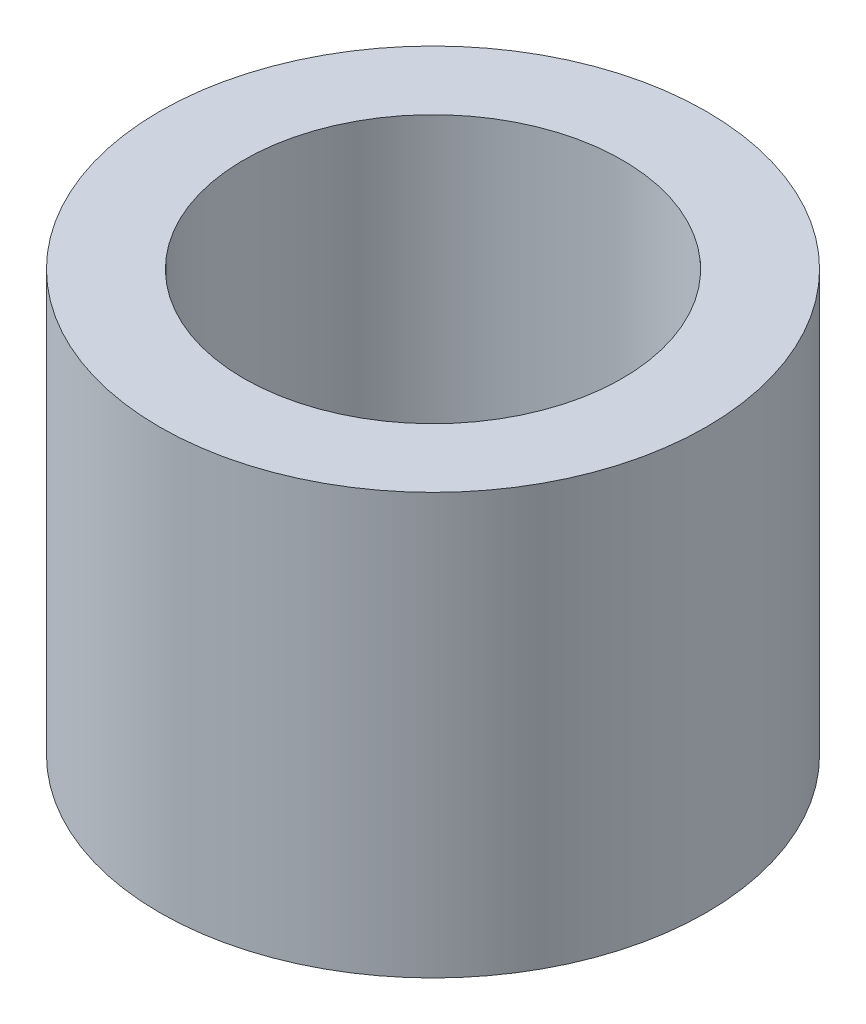
ISO-10303-21;
HEADER;
FILE_DESCRIPTION(('STEP AP214'),'2;1');
FILE_NAME('part.step','',(''),(''),'','','');
FILE_SCHEMA(('AUTOMOTIVE_DESIGN { 1 0 10303 214 1 1 1 1 }'));
ENDSEC;
DATA;
#1=APPLICATION_CONTEXT('core data for automotive mechanical design processes');
#2=APPLICATION_PROTOCOL_DEFINITION('international standard','automotive_design',2000,#1);
#3=PRODUCT_CONTEXT('',#1,'mechanical');
#4=PRODUCT('Part','Part','',(#3));
#5=PRODUCT_RELATED_PRODUCT_CATEGORY('part','',(#4));
#6=PRODUCT_DEFINITION_FORMATION('','',#4);
#7=PRODUCT_DEFINITION_CONTEXT('part definition',#1,'design');
#8=PRODUCT_DEFINITION('design','',#6,#7);
#9=PRODUCT_DEFINITION_SHAPE('','',#8);
#10=(LENGTH_UNIT() NAMED_UNIT(*) SI_UNIT(.MILLI.,.METRE.));
#11=(NAMED_UNIT(*) PLANE_ANGLE_UNIT() SI_UNIT($,.RADIAN.));
#12=(NAMED_UNIT(*) SI_UNIT($,.STERADIAN.) SOLID_ANGLE_UNIT());
#13=UNCERTAINTY_MEASURE_WITH_UNIT(LENGTH_MEASURE(1.E-05),#10,'distance_accuracy_value','');
#14=(GEOMETRIC_REPRESENTATION_CONTEXT(3) GLOBAL_UNCERTAINTY_ASSIGNED_CONTEXT((#13)) GLOBAL_UNIT_ASSIGNED_CONTEXT((#10,
#11,#12)) REPRESENTATION_CONTEXT('',''));
#15=CARTESIAN_POINT('',(0.,0.,0.));
#16=DIRECTION('',(0.,0.,1.));
#17=DIRECTION('',(1.,0.,0.));
#18=AXIS2_PLACEMENT_3D('',#15,#16,#17);
#19=CARTESIAN_POINT('',(0.,5.,0.));
#20=DIRECTION('',(0.,1.,0.));
#21=DIRECTION('',(0.,0.,1.));
#22=AXIS2_PLACEMENT_3D('',#19,#20,#21);
#23=PLANE('',#22);
#24=CARTESIAN_POINT('',(0.,5.,0.));
#25=DIRECTION('',(0.,1.,0.));
#26=DIRECTION('',(0.,0.,1.));
#27=AXIS2_PLACEMENT_3D('',#24,#25,#26);
#28=CIRCLE('',#27,3.25);
#29=CARTESIAN_POINT('',(0.,5.,3.25));
#30=VERTEX_POINT('',#29);
#31=EDGE_CURVE('E10',#30,#30,#28,.T.);
#32=ORIENTED_EDGE('',*,*,#31,.T.);
#33=EDGE_LOOP('',(#32));
#34=FACE_BOUND('',#33,.T.);
#35=CARTESIAN_POINT('',(0.,5.,0.));
#36=DIRECTION('',(0.,1.,0.));
#37=DIRECTION('',(0.,0.,1.));
#38=AXIS2_PLACEMENT_3D('',#35,#36,#37);
#39=CIRCLE('',#38,2.25);
#40=CARTESIAN_POINT('',(0.,5.,2.25));
#41=VERTEX_POINT('',#40);
#42=EDGE_CURVE('E48',#41,#41,#39,.T.);
#43=ORIENTED_EDGE('',*,*,#42,.F.);
#44=EDGE_LOOP('',(#43));
#45=FACE_BOUND('',#44,.T.);
#46=ADVANCED_FACE('F40',(#34,#45),#23,.T.);
#47=CARTESIAN_POINT('',(0.,0.,0.));
#48=DIRECTION('',(0.,1.,0.));
#49=DIRECTION('',(0.,0.,1.));
#50=AXIS2_PLACEMENT_3D('',#47,#48,#49);
#51=PLANE('',#50);
#52=CARTESIAN_POINT('',(0.,0.,0.));
#53=DIRECTION('',(0.,1.,0.));
#54=DIRECTION('',(0.,0.,1.));
#55=AXIS2_PLACEMENT_3D('',#52,#53,#54);
#56=CIRCLE('',#55,3.25);
#57=CARTESIAN_POINT('',(0.,0.,3.25));
#58=VERTEX_POINT('',#57);
#59=EDGE_CURVE('E41',#58,#58,#56,.T.);
#60=ORIENTED_EDGE('',*,*,#59,.F.);
#61=EDGE_LOOP('',(#60));
#62=FACE_BOUND('',#61,.T.);
#63=CARTESIAN_POINT('',(0.,0.,0.));
#64=DIRECTION('',(0.,1.,0.));
#65=DIRECTION('',(0.,0.,1.));
#66=AXIS2_PLACEMENT_3D('',#63,#64,#65);
#67=CIRCLE('',#66,2.25);
#68=CARTESIAN_POINT('',(0.,0.,2.25));
#69=VERTEX_POINT('',#68);
#70=EDGE_CURVE('E49',#69,#69,#67,.T.);
#71=ORIENTED_EDGE('',*,*,#70,.T.);
#72=EDGE_LOOP('',(#71));
#73=FACE_BOUND('',#72,.T.);
#74=ADVANCED_FACE('F58',(#62,#73),#51,.F.);
#75=CARTESIAN_POINT('',(0.,5.,0.));
#76=DIRECTION('',(0.,-1.,0.));
#77=DIRECTION('',(0.,0.,-1.));
#78=AXIS2_PLACEMENT_3D('',#75,#76,#77);
#79=CYLINDRICAL_SURFACE('',#78,3.25);
#80=ORIENTED_EDGE('',*,*,#31,.F.);
#81=EDGE_LOOP('',(#80));
#82=FACE_BOUND('',#81,.T.);
#83=ORIENTED_EDGE('',*,*,#59,.T.);
#84=EDGE_LOOP('',(#83));
#85=FACE_BOUND('',#84,.T.);
#86=ADVANCED_FACE('F39',(#82,#85),#79,.T.);
#87=CARTESIAN_POINT('',(0.,5.,0.));
#88=DIRECTION('',(0.,-1.,0.));
#89=DIRECTION('',(0.,0.,-1.));
#90=AXIS2_PLACEMENT_3D('',#87,#88,#89);
#91=CYLINDRICAL_SURFACE('',#90,2.25);
#92=ORIENTED_EDGE('',*,*,#42,.T.);
#93=EDGE_LOOP('',(#92));
#94=FACE_BOUND('',#93,.T.);
#95=ORIENTED_EDGE('',*,*,#70,.F.);
#96=EDGE_LOOP('',(#95));
#97=FACE_BOUND('',#96,.T.);
#98=ADVANCED_FACE('F57',(#94,#97),#91,.F.);
#99=CLOSED_SHELL('',(#46,#74,#86,#98));
#100=MANIFOLD_SOLID_BREP('B2',#99);
#101=ADVANCED_BREP_SHAPE_REPRESENTATION('',(#18,#100),#14);
#102=SHAPE_DEFINITION_REPRESENTATION(#9,#101);
ENDSEC;
END-ISO-10303-21;
